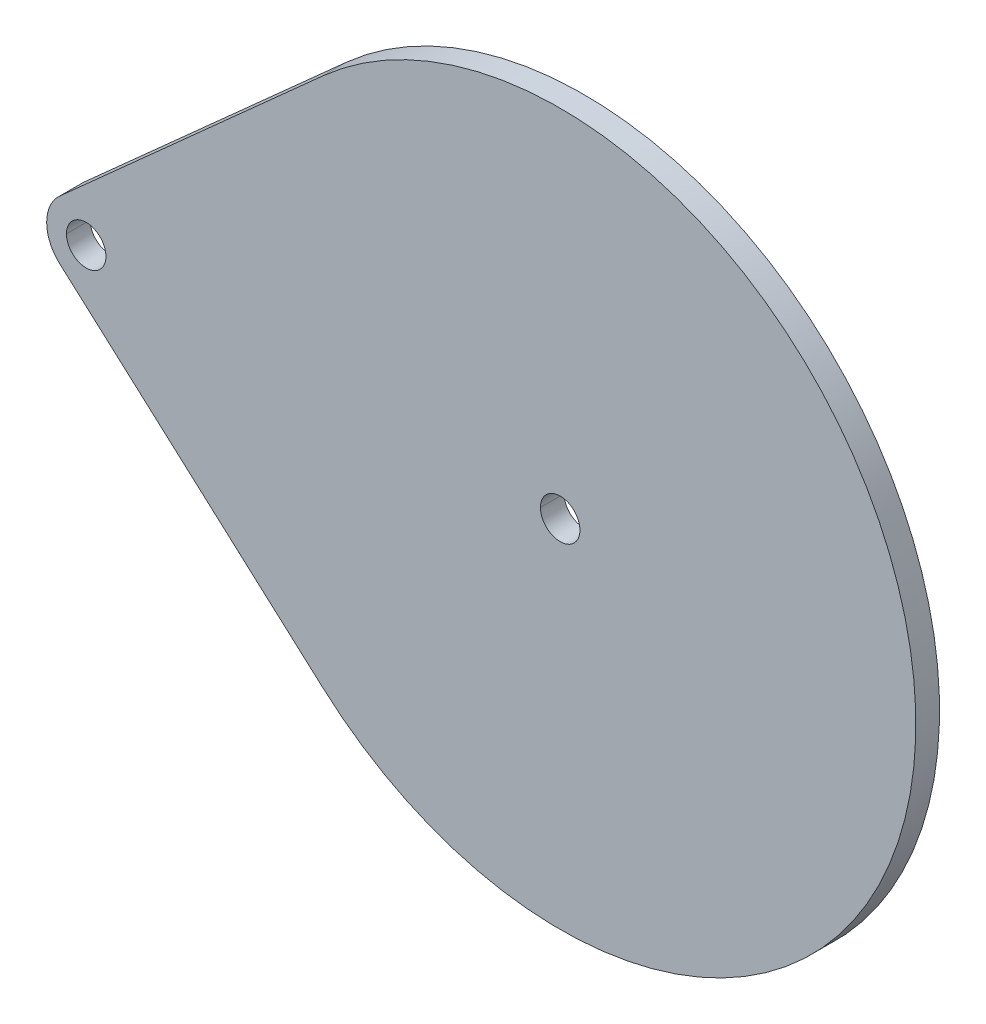
ISO-10303-21;
HEADER;
FILE_DESCRIPTION(('STEP AP214'),'2;1');
FILE_NAME('part.step','',(''),(''),'','','');
FILE_SCHEMA(('AUTOMOTIVE_DESIGN { 1 0 10303 214 1 1 1 1 }'));
ENDSEC;
DATA;
#1=APPLICATION_CONTEXT('core data for automotive mechanical design processes');
#2=APPLICATION_PROTOCOL_DEFINITION('international standard','automotive_design',2000,#1);
#3=PRODUCT_CONTEXT('',#1,'mechanical');
#4=PRODUCT('Part','Part','',(#3));
#5=PRODUCT_RELATED_PRODUCT_CATEGORY('part','',(#4));
#6=PRODUCT_DEFINITION_FORMATION('','',#4);
#7=PRODUCT_DEFINITION_CONTEXT('part definition',#1,'design');
#8=PRODUCT_DEFINITION('design','',#6,#7);
#9=PRODUCT_DEFINITION_SHAPE('','',#8);
#10=(LENGTH_UNIT() NAMED_UNIT(*) SI_UNIT(.MILLI.,.METRE.));
#11=(NAMED_UNIT(*) PLANE_ANGLE_UNIT() SI_UNIT($,.RADIAN.));
#12=(NAMED_UNIT(*) SI_UNIT($,.STERADIAN.) SOLID_ANGLE_UNIT());
#13=UNCERTAINTY_MEASURE_WITH_UNIT(LENGTH_MEASURE(1.E-05),#10,'distance_accuracy_value','');
#14=(GEOMETRIC_REPRESENTATION_CONTEXT(3) GLOBAL_UNCERTAINTY_ASSIGNED_CONTEXT((#13)) GLOBAL_UNIT_ASSIGNED_CONTEXT((#10,
#11,#12)) REPRESENTATION_CONTEXT('',''));
#15=CARTESIAN_POINT('',(0.,0.,0.));
#16=DIRECTION('',(0.,0.,1.));
#17=DIRECTION('',(1.,0.,0.));
#18=AXIS2_PLACEMENT_3D('',#15,#16,#17);
#19=CARTESIAN_POINT('',(151.108895878077,-4.09770239178581,0.));
#20=DIRECTION('',(0.,0.,1.));
#21=DIRECTION('',(1.,0.,0.));
#22=AXIS2_PLACEMENT_3D('',#19,#20,#21);
#23=CYLINDRICAL_SURFACE('',#22,2.5);
#24=DIRECTION('',(0.,0.,1.));
#25=VECTOR('',#24,1.);
#26=CARTESIAN_POINT('',(148.608895878077,-4.09770239178581,0.));
#27=LINE('',#26,#25);
#28=CARTESIAN_POINT('',(148.608895878077,-4.09770239178581,0.));
#29=VERTEX_POINT('',#28);
#30=CARTESIAN_POINT('',(148.608895878077,-4.09770239178581,3.));
#31=VERTEX_POINT('',#30);
#32=EDGE_CURVE('E131',#29,#31,#27,.T.);
#33=ORIENTED_EDGE('',*,*,#32,.F.);
#34=CARTESIAN_POINT('',(151.108895878077,-4.09770239178581,0.));
#35=DIRECTION('',(0.,0.,1.));
#36=DIRECTION('',(1.,0.,0.));
#37=AXIS2_PLACEMENT_3D('',#34,#35,#36);
#38=CIRCLE('',#37,2.5);
#39=CARTESIAN_POINT('',(153.608895878077,-4.09770239178581,0.));
#40=VERTEX_POINT('',#39);
#41=EDGE_CURVE('E126',#40,#29,#38,.T.);
#42=ORIENTED_EDGE('',*,*,#41,.F.);
#43=DIRECTION('',(0.,0.,1.));
#44=VECTOR('',#43,1.);
#45=CARTESIAN_POINT('',(153.608895878077,-4.09770239178581,0.));
#46=LINE('',#45,#44);
#47=CARTESIAN_POINT('',(153.608895878077,-4.09770239178581,3.));
#48=VERTEX_POINT('',#47);
#49=EDGE_CURVE('E128',#40,#48,#46,.T.);
#50=ORIENTED_EDGE('',*,*,#49,.T.);
#51=CARTESIAN_POINT('',(151.108895878077,-4.09770239178581,3.));
#52=DIRECTION('',(0.,0.,1.));
#53=DIRECTION('',(1.,0.,0.));
#54=AXIS2_PLACEMENT_3D('',#51,#52,#53);
#55=CIRCLE('',#54,2.5);
#56=EDGE_CURVE('E175',#48,#31,#55,.T.);
#57=ORIENTED_EDGE('',*,*,#56,.T.);
#58=EDGE_LOOP('',(#33,#42,#50,#57));
#59=FACE_BOUND('',#58,.T.);
#60=ADVANCED_FACE('F15',(#59),#23,.F.);
#61=CARTESIAN_POINT('',(91.1088958780771,-4.0977023917858,3.));
#62=DIRECTION('',(0.,0.,-1.));
#63=DIRECTION('',(-1.,0.,0.));
#64=AXIS2_PLACEMENT_3D('',#61,#62,#63);
#65=CYLINDRICAL_SURFACE('',#64,2.5);
#66=DIRECTION('',(0.,0.,-1.));
#67=VECTOR('',#66,1.);
#68=CARTESIAN_POINT('',(93.6088958780771,-4.0977023917858,3.));
#69=LINE('',#68,#67);
#70=CARTESIAN_POINT('',(93.6088958780771,-4.0977023917858,3.));
#71=VERTEX_POINT('',#70);
#72=CARTESIAN_POINT('',(93.6088958780771,-4.0977023917858,0.));
#73=VERTEX_POINT('',#72);
#74=EDGE_CURVE('E172',#71,#73,#69,.T.);
#75=ORIENTED_EDGE('',*,*,#74,.F.);
#76=CARTESIAN_POINT('',(91.1088958780771,-4.0977023917858,3.));
#77=DIRECTION('',(0.,0.,1.));
#78=DIRECTION('',(1.,0.,0.));
#79=AXIS2_PLACEMENT_3D('',#76,#77,#78);
#80=CIRCLE('',#79,2.5);
#81=CARTESIAN_POINT('',(88.6088958780771,-4.0977023917858,3.));
#82=VERTEX_POINT('',#81);
#83=EDGE_CURVE('E161',#71,#82,#80,.T.);
#84=ORIENTED_EDGE('',*,*,#83,.T.);
#85=DIRECTION('',(0.,0.,-1.));
#86=VECTOR('',#85,1.);
#87=CARTESIAN_POINT('',(88.6088958780771,-4.0977023917858,3.));
#88=LINE('',#87,#86);
#89=CARTESIAN_POINT('',(88.6088958780771,-4.0977023917858,0.));
#90=VERTEX_POINT('',#89);
#91=EDGE_CURVE('E171',#82,#90,#88,.T.);
#92=ORIENTED_EDGE('',*,*,#91,.T.);
#93=CARTESIAN_POINT('',(91.1088958780771,-4.0977023917858,0.));
#94=DIRECTION('',(0.,0.,1.));
#95=DIRECTION('',(1.,0.,0.));
#96=AXIS2_PLACEMENT_3D('',#93,#94,#95);
#97=CIRCLE('',#96,2.5);
#98=EDGE_CURVE('E18',#73,#90,#97,.T.);
#99=ORIENTED_EDGE('',*,*,#98,.F.);
#100=EDGE_LOOP('',(#75,#84,#92,#99));
#101=FACE_BOUND('',#100,.T.);
#102=ADVANCED_FACE('F291',(#101),#65,.F.);
#103=CARTESIAN_POINT('',(87.7733619721445,-0.372891851318871,3.));
#104=DIRECTION('',(0.667106781186534,-0.744962108093386,0.));
#105=DIRECTION('',(0.,0.,-1.));
#106=AXIS2_PLACEMENT_3D('',#103,#104,#105);
#107=PLANE('',#106);
#108=DIRECTION('',(-0.744962108093386,-0.667106781186534,0.));
#109=VECTOR('',#108,1.);
#110=CARTESIAN_POINT('',(87.7733619721445,-0.372891851318871,0.));
#111=LINE('',#110,#109);
#112=CARTESIAN_POINT('',(121.071474521841,29.4452645908479,0.));
#113=VERTEX_POINT('',#112);
#114=CARTESIAN_POINT('',(87.7733619721445,-0.372891851318871,0.));
#115=VERTEX_POINT('',#114);
#116=EDGE_CURVE('E160',#113,#115,#111,.T.);
#117=ORIENTED_EDGE('',*,*,#116,.T.);
#118=DIRECTION('',(0.,0.,-1.));
#119=VECTOR('',#118,1.);
#120=CARTESIAN_POINT('',(87.7733619721445,-0.372891851318871,3.));
#121=LINE('',#120,#119);
#122=CARTESIAN_POINT('',(87.7733619721445,-0.372891851318871,3.));
#123=VERTEX_POINT('',#122);
#124=EDGE_CURVE('E211',#123,#115,#121,.T.);
#125=ORIENTED_EDGE('',*,*,#124,.F.);
#126=DIRECTION('',(-0.744962108093386,-0.667106781186534,0.));
#127=VECTOR('',#126,1.);
#128=CARTESIAN_POINT('',(87.7733619721445,-0.372891851318871,3.));
#129=LINE('',#128,#127);
#130=CARTESIAN_POINT('',(121.071474521841,29.4452645908479,3.));
#131=VERTEX_POINT('',#130);
#132=EDGE_CURVE('E165',#131,#123,#129,.T.);
#133=ORIENTED_EDGE('',*,*,#132,.F.);
#134=DIRECTION('',(0.,0.,-1.));
#135=VECTOR('',#134,1.);
#136=CARTESIAN_POINT('',(121.071474521841,29.4452645908479,3.));
#137=LINE('',#136,#135);
#138=EDGE_CURVE('E9',#131,#113,#137,.T.);
#139=ORIENTED_EDGE('',*,*,#138,.T.);
#140=EDGE_LOOP('',(#117,#125,#133,#139));
#141=FACE_BOUND('',#140,.T.);
#142=ADVANCED_FACE('F279',(#141),#107,.F.);
#143=CARTESIAN_POINT('',(151.108895878077,-4.09770239178581,3.));
#144=DIRECTION('',(0.,0.,-1.));
#145=DIRECTION('',(-1.,0.,0.));
#146=AXIS2_PLACEMENT_3D('',#143,#144,#145);
#147=CYLINDRICAL_SURFACE('',#146,45.026406871192);
#148=CARTESIAN_POINT('',(151.108895878077,-4.09770239178581,0.));
#149=DIRECTION('',(0.,0.,1.));
#150=DIRECTION('',(-1.,0.,0.));
#151=AXIS2_PLACEMENT_3D('',#148,#149,#150);
#152=CIRCLE('',#151,45.026406871192);
#153=CARTESIAN_POINT('',(121.071474521841,-37.6406693744195,0.));
#154=VERTEX_POINT('',#153);
#155=EDGE_CURVE('E187',#154,#113,#152,.T.);
#156=ORIENTED_EDGE('',*,*,#155,.T.);
#157=ORIENTED_EDGE('',*,*,#138,.F.);
#158=CARTESIAN_POINT('',(151.108895878077,-4.09770239178581,3.));
#159=DIRECTION('',(0.,0.,1.));
#160=DIRECTION('',(-1.,0.,0.));
#161=AXIS2_PLACEMENT_3D('',#158,#159,#160);
#162=CIRCLE('',#161,45.026406871192);
#163=CARTESIAN_POINT('',(121.071474521841,-37.6406693744195,3.));
#164=VERTEX_POINT('',#163);
#165=EDGE_CURVE('E162',#164,#131,#162,.T.);
#166=ORIENTED_EDGE('',*,*,#165,.F.);
#167=DIRECTION('',(0.,0.,-1.));
#168=VECTOR('',#167,1.);
#169=CARTESIAN_POINT('',(121.071474521841,-37.6406693744195,3.));
#170=LINE('',#169,#168);
#171=EDGE_CURVE('E25',#164,#154,#170,.T.);
#172=ORIENTED_EDGE('',*,*,#171,.T.);
#173=EDGE_LOOP('',(#156,#157,#166,#172));
#174=FACE_BOUND('',#173,.T.);
#175=ADVANCED_FACE('F273',(#174),#147,.T.);
#176=CARTESIAN_POINT('',(87.7733619721444,-7.82251293225274,3.));
#177=DIRECTION('',(0.667106781186533,0.744962108093387,0.));
#178=DIRECTION('',(0.,0.,-1.));
#179=AXIS2_PLACEMENT_3D('',#176,#177,#178);
#180=PLANE('',#179);
#181=DIRECTION('',(0.744962108093387,-0.667106781186533,0.));
#182=VECTOR('',#181,1.);
#183=CARTESIAN_POINT('',(87.7733619721444,-7.82251293225274,0.));
#184=LINE('',#183,#182);
#185=CARTESIAN_POINT('',(87.7733619721444,-7.82251293225274,0.));
#186=VERTEX_POINT('',#185);
#187=EDGE_CURVE('E136',#186,#154,#184,.T.);
#188=ORIENTED_EDGE('',*,*,#187,.T.);
#189=ORIENTED_EDGE('',*,*,#171,.F.);
#190=DIRECTION('',(0.744962108093387,-0.667106781186533,0.));
#191=VECTOR('',#190,1.);
#192=CARTESIAN_POINT('',(87.7733619721444,-7.82251293225274,3.));
#193=LINE('',#192,#191);
#194=CARTESIAN_POINT('',(87.7733619721444,-7.82251293225274,3.));
#195=VERTEX_POINT('',#194);
#196=EDGE_CURVE('E74',#195,#164,#193,.T.);
#197=ORIENTED_EDGE('',*,*,#196,.F.);
#198=DIRECTION('',(0.,0.,-1.));
#199=VECTOR('',#198,1.);
#200=CARTESIAN_POINT('',(87.7733619721444,-7.82251293225274,3.));
#201=LINE('',#200,#199);
#202=EDGE_CURVE('E180',#195,#186,#201,.T.);
#203=ORIENTED_EDGE('',*,*,#202,.T.);
#204=EDGE_LOOP('',(#188,#189,#197,#203));
#205=FACE_BOUND('',#204,.T.);
#206=ADVANCED_FACE('F278',(#205),#180,.F.);
#207=CARTESIAN_POINT('',(91.1088958780771,-4.0977023917858,3.));
#208=DIRECTION('',(0.,0.,-1.));
#209=DIRECTION('',(-1.,0.,0.));
#210=AXIS2_PLACEMENT_3D('',#207,#208,#209);
#211=CYLINDRICAL_SURFACE('',#210,5.);
#212=DIRECTION('',(0.,0.,-1.));
#213=VECTOR('',#212,1.);
#214=CARTESIAN_POINT('',(86.1088958780772,-4.0977023917858,3.));
#215=LINE('',#214,#213);
#216=CARTESIAN_POINT('',(86.1088958780772,-4.0977023917858,3.));
#217=VERTEX_POINT('',#216);
#218=CARTESIAN_POINT('',(86.1088958780772,-4.0977023917858,0.));
#219=VERTEX_POINT('',#218);
#220=EDGE_CURVE('E202',#217,#219,#215,.T.);
#221=ORIENTED_EDGE('',*,*,#220,.F.);
#222=CARTESIAN_POINT('',(91.1088958780771,-4.0977023917858,3.));
#223=DIRECTION('',(0.,0.,1.));
#224=DIRECTION('',(1.,0.,0.));
#225=AXIS2_PLACEMENT_3D('',#222,#223,#224);
#226=CIRCLE('',#225,5.);
#227=EDGE_CURVE('E87',#123,#217,#226,.T.);
#228=ORIENTED_EDGE('',*,*,#227,.F.);
#229=ORIENTED_EDGE('',*,*,#124,.T.);
#230=CARTESIAN_POINT('',(91.1088958780771,-4.0977023917858,0.));
#231=DIRECTION('',(0.,0.,1.));
#232=DIRECTION('',(1.,0.,0.));
#233=AXIS2_PLACEMENT_3D('',#230,#231,#232);
#234=CIRCLE('',#233,5.);
#235=EDGE_CURVE('E158',#115,#219,#234,.T.);
#236=ORIENTED_EDGE('',*,*,#235,.T.);
#237=EDGE_LOOP('',(#221,#228,#229,#236));
#238=FACE_BOUND('',#237,.T.);
#239=ADVANCED_FACE('F264',(#238),#211,.T.);
#240=CARTESIAN_POINT('',(91.1088958780771,-4.0977023917858,0.));
#241=DIRECTION('',(0.,0.,1.));
#242=DIRECTION('',(1.,0.,0.));
#243=AXIS2_PLACEMENT_3D('',#240,#241,#242);
#244=PLANE('',#243);
#245=CARTESIAN_POINT('',(91.1088958780771,-4.0977023917858,0.));
#246=DIRECTION('',(0.,0.,1.));
#247=DIRECTION('',(1.,0.,0.));
#248=AXIS2_PLACEMENT_3D('',#245,#246,#247);
#249=CIRCLE('',#248,2.5);
#250=EDGE_CURVE('E167',#90,#73,#249,.T.);
#251=ORIENTED_EDGE('',*,*,#250,.T.);
#252=ORIENTED_EDGE('',*,*,#98,.T.);
#253=EDGE_LOOP('',(#251,#252));
#254=FACE_BOUND('',#253,.T.);
#255=ORIENTED_EDGE('',*,*,#41,.T.);
#256=CARTESIAN_POINT('',(151.108895878077,-4.09770239178581,0.));
#257=DIRECTION('',(0.,0.,1.));
#258=DIRECTION('',(1.,0.,0.));
#259=AXIS2_PLACEMENT_3D('',#256,#257,#258);
#260=CIRCLE('',#259,2.5);
#261=EDGE_CURVE('E140',#29,#40,#260,.T.);
#262=ORIENTED_EDGE('',*,*,#261,.T.);
#263=EDGE_LOOP('',(#255,#262));
#264=FACE_BOUND('',#263,.T.);
#265=ORIENTED_EDGE('',*,*,#235,.F.);
#266=ORIENTED_EDGE('',*,*,#116,.F.);
#267=ORIENTED_EDGE('',*,*,#155,.F.);
#268=ORIENTED_EDGE('',*,*,#187,.F.);
#269=CARTESIAN_POINT('',(91.1088958780771,-4.0977023917858,0.));
#270=DIRECTION('',(0.,0.,1.));
#271=DIRECTION('',(1.,0.,0.));
#272=AXIS2_PLACEMENT_3D('',#269,#270,#271);
#273=CIRCLE('',#272,5.);
#274=EDGE_CURVE('E183',#219,#186,#273,.T.);
#275=ORIENTED_EDGE('',*,*,#274,.F.);
#276=EDGE_LOOP('',(#265,#266,#267,#268,#275));
#277=FACE_BOUND('',#276,.T.);
#278=ADVANCED_FACE('F146',(#254,#264,#277),#244,.F.);
#279=CARTESIAN_POINT('',(91.1088958780771,-4.0977023917858,3.));
#280=DIRECTION('',(0.,0.,1.));
#281=DIRECTION('',(1.,0.,0.));
#282=AXIS2_PLACEMENT_3D('',#279,#280,#281);
#283=PLANE('',#282);
#284=CARTESIAN_POINT('',(91.1088958780771,-4.0977023917858,3.));
#285=DIRECTION('',(0.,0.,1.));
#286=DIRECTION('',(1.,0.,0.));
#287=AXIS2_PLACEMENT_3D('',#284,#285,#286);
#288=CIRCLE('',#287,2.5);
#289=EDGE_CURVE('E144',#82,#71,#288,.T.);
#290=ORIENTED_EDGE('',*,*,#289,.F.);
#291=ORIENTED_EDGE('',*,*,#83,.F.);
#292=EDGE_LOOP('',(#290,#291));
#293=FACE_BOUND('',#292,.T.);
#294=ORIENTED_EDGE('',*,*,#56,.F.);
#295=CARTESIAN_POINT('',(151.108895878077,-4.09770239178581,3.));
#296=DIRECTION('',(0.,0.,1.));
#297=DIRECTION('',(1.,0.,0.));
#298=AXIS2_PLACEMENT_3D('',#295,#296,#297);
#299=CIRCLE('',#298,2.5);
#300=EDGE_CURVE('E142',#31,#48,#299,.T.);
#301=ORIENTED_EDGE('',*,*,#300,.F.);
#302=EDGE_LOOP('',(#294,#301));
#303=FACE_BOUND('',#302,.T.);
#304=ORIENTED_EDGE('',*,*,#227,.T.);
#305=CARTESIAN_POINT('',(91.1088958780771,-4.0977023917858,3.));
#306=DIRECTION('',(0.,0.,1.));
#307=DIRECTION('',(1.,0.,0.));
#308=AXIS2_PLACEMENT_3D('',#305,#306,#307);
#309=CIRCLE('',#308,5.);
#310=EDGE_CURVE('E193',#217,#195,#309,.T.);
#311=ORIENTED_EDGE('',*,*,#310,.T.);
#312=ORIENTED_EDGE('',*,*,#196,.T.);
#313=ORIENTED_EDGE('',*,*,#165,.T.);
#314=ORIENTED_EDGE('',*,*,#132,.T.);
#315=EDGE_LOOP('',(#304,#311,#312,#313,#314));
#316=FACE_BOUND('',#315,.T.);
#317=ADVANCED_FACE('F232',(#293,#303,#316),#283,.T.);
#318=CARTESIAN_POINT('',(91.1088958780771,-4.0977023917858,3.));
#319=DIRECTION('',(0.,0.,-1.));
#320=DIRECTION('',(-1.,0.,0.));
#321=AXIS2_PLACEMENT_3D('',#318,#319,#320);
#322=CYLINDRICAL_SURFACE('',#321,5.);
#323=ORIENTED_EDGE('',*,*,#310,.F.);
#324=ORIENTED_EDGE('',*,*,#220,.T.);
#325=ORIENTED_EDGE('',*,*,#274,.T.);
#326=ORIENTED_EDGE('',*,*,#202,.F.);
#327=EDGE_LOOP('',(#323,#324,#325,#326));
#328=FACE_BOUND('',#327,.T.);
#329=ADVANCED_FACE('F237',(#328),#322,.T.);
#330=CARTESIAN_POINT('',(91.1088958780771,-4.0977023917858,3.));
#331=DIRECTION('',(0.,0.,-1.));
#332=DIRECTION('',(-1.,0.,0.));
#333=AXIS2_PLACEMENT_3D('',#330,#331,#332);
#334=CYLINDRICAL_SURFACE('',#333,2.5);
#335=ORIENTED_EDGE('',*,*,#289,.T.);
#336=ORIENTED_EDGE('',*,*,#74,.T.);
#337=ORIENTED_EDGE('',*,*,#250,.F.);
#338=ORIENTED_EDGE('',*,*,#91,.F.);
#339=EDGE_LOOP('',(#335,#336,#337,#338));
#340=FACE_BOUND('',#339,.T.);
#341=ADVANCED_FACE('F248',(#340),#334,.F.);
#342=CARTESIAN_POINT('',(151.108895878077,-4.09770239178581,0.));
#343=DIRECTION('',(0.,0.,1.));
#344=DIRECTION('',(1.,0.,0.));
#345=AXIS2_PLACEMENT_3D('',#342,#343,#344);
#346=CYLINDRICAL_SURFACE('',#345,2.5);
#347=ORIENTED_EDGE('',*,*,#261,.F.);
#348=ORIENTED_EDGE('',*,*,#32,.T.);
#349=ORIENTED_EDGE('',*,*,#300,.T.);
#350=ORIENTED_EDGE('',*,*,#49,.F.);
#351=EDGE_LOOP('',(#347,#348,#349,#350));
#352=FACE_BOUND('',#351,.T.);
#353=ADVANCED_FACE('F139',(#352),#346,.F.);
#354=CLOSED_SHELL('',(#60,#102,#142,#175,#206,#239,#278,#317,#329,#341,#353));
#355=MANIFOLD_SOLID_BREP('B1',#354);
#356=ADVANCED_BREP_SHAPE_REPRESENTATION('',(#18,#355),#14);
#357=SHAPE_DEFINITION_REPRESENTATION(#9,#356);
ENDSEC;
END-ISO-10303-21;
